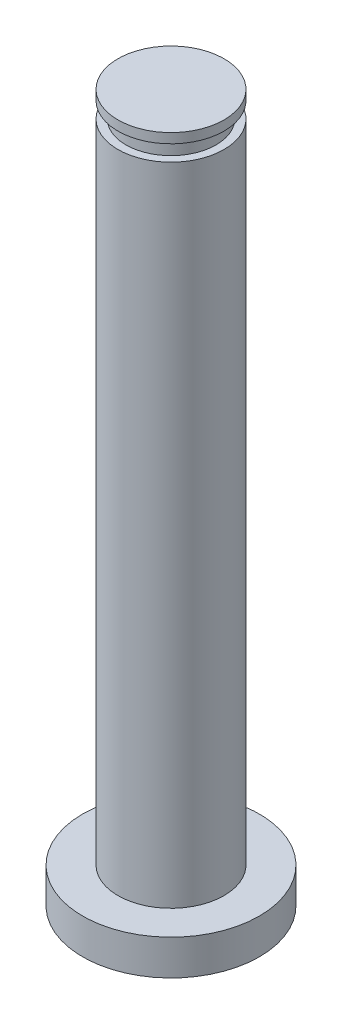
ISO-10303-21;
HEADER;
FILE_DESCRIPTION(('STEP AP214'),'2;1');
FILE_NAME('part.step','',(''),(''),'','','');
FILE_SCHEMA(('AUTOMOTIVE_DESIGN { 1 0 10303 214 1 1 1 1 }'));
ENDSEC;
DATA;
#1=APPLICATION_CONTEXT('core data for automotive mechanical design processes');
#2=APPLICATION_PROTOCOL_DEFINITION('international standard','automotive_design',2000,#1);
#3=PRODUCT_CONTEXT('',#1,'mechanical');
#4=PRODUCT('Part','Part','',(#3));
#5=PRODUCT_RELATED_PRODUCT_CATEGORY('part','',(#4));
#6=PRODUCT_DEFINITION_FORMATION('','',#4);
#7=PRODUCT_DEFINITION_CONTEXT('part definition',#1,'design');
#8=PRODUCT_DEFINITION('design','',#6,#7);
#9=PRODUCT_DEFINITION_SHAPE('','',#8);
#10=(LENGTH_UNIT() NAMED_UNIT(*) SI_UNIT(.MILLI.,.METRE.));
#11=(NAMED_UNIT(*) PLANE_ANGLE_UNIT() SI_UNIT($,.RADIAN.));
#12=(NAMED_UNIT(*) SI_UNIT($,.STERADIAN.) SOLID_ANGLE_UNIT());
#13=UNCERTAINTY_MEASURE_WITH_UNIT(LENGTH_MEASURE(1.E-05),#10,'distance_accuracy_value','');
#14=(GEOMETRIC_REPRESENTATION_CONTEXT(3) GLOBAL_UNCERTAINTY_ASSIGNED_CONTEXT((#13)) GLOBAL_UNIT_ASSIGNED_CONTEXT((#10,
#11,#12)) REPRESENTATION_CONTEXT('',''));
#15=CARTESIAN_POINT('',(0.,0.,0.));
#16=DIRECTION('',(0.,0.,1.));
#17=DIRECTION('',(1.,0.,0.));
#18=AXIS2_PLACEMENT_3D('',#15,#16,#17);
#19=CARTESIAN_POINT('',(-15.,178.,244.));
#20=DIRECTION('',(0.,-1.,0.));
#21=DIRECTION('',(-1.,0.,0.));
#22=AXIS2_PLACEMENT_3D('',#19,#20,#21);
#23=PLANE('',#22);
#24=CARTESIAN_POINT('',(-15.,178.,244.));
#25=DIRECTION('',(0.,-1.,0.));
#26=DIRECTION('',(1.,0.,0.));
#27=AXIS2_PLACEMENT_3D('',#24,#25,#26);
#28=CIRCLE('',#27,3.);
#29=CARTESIAN_POINT('',(-12.,178.,244.));
#30=VERTEX_POINT('',#29);
#31=EDGE_CURVE('E11',#30,#30,#28,.T.);
#32=ORIENTED_EDGE('',*,*,#31,.F.);
#33=EDGE_LOOP('',(#32));
#34=FACE_BOUND('',#33,.T.);
#35=ADVANCED_FACE('F16',(#34),#23,.F.);
#36=CARTESIAN_POINT('',(-15.,178.,244.));
#37=DIRECTION('',(0.,-1.,0.));
#38=DIRECTION('',(1.,0.,0.));
#39=AXIS2_PLACEMENT_3D('',#36,#37,#38);
#40=CYLINDRICAL_SURFACE('',#39,3.);
#41=CARTESIAN_POINT('',(-15.,177.45,244.));
#42=DIRECTION('',(0.,-1.,0.));
#43=DIRECTION('',(1.,0.,0.));
#44=AXIS2_PLACEMENT_3D('',#41,#42,#43);
#45=CIRCLE('',#44,3.);
#46=CARTESIAN_POINT('',(-12.,177.45,244.));
#47=VERTEX_POINT('',#46);
#48=EDGE_CURVE('E90',#47,#47,#45,.T.);
#49=ORIENTED_EDGE('',*,*,#48,.F.);
#50=DIRECTION('',(0.,-1.,0.));
#51=VECTOR('',#50,1.);
#52=CARTESIAN_POINT('',(-12.,178.,244.));
#53=LINE('',#52,#51);
#54=EDGE_CURVE('E25',#30,#47,#53,.T.);
#55=ORIENTED_EDGE('',*,*,#54,.F.);
#56=ORIENTED_EDGE('',*,*,#31,.T.);
#57=ORIENTED_EDGE('',*,*,#54,.T.);
#58=EDGE_LOOP('',(#49,#55,#56,#57));
#59=FACE_BOUND('',#58,.T.);
#60=ADVANCED_FACE('F18',(#59),#40,.T.);
#61=CARTESIAN_POINT('',(-15.,177.45,244.));
#62=DIRECTION('',(0.,-1.,0.));
#63=DIRECTION('',(-1.,0.,0.));
#64=AXIS2_PLACEMENT_3D('',#61,#62,#63);
#65=PLANE('',#64);
#66=CARTESIAN_POINT('',(-15.,177.45,244.));
#67=DIRECTION('',(0.,-1.,0.));
#68=DIRECTION('',(1.,0.,0.));
#69=AXIS2_PLACEMENT_3D('',#66,#67,#68);
#70=CIRCLE('',#69,2.55);
#71=CARTESIAN_POINT('',(-12.45,177.45,244.));
#72=VERTEX_POINT('',#71);
#73=EDGE_CURVE('E96',#72,#72,#70,.T.);
#74=ORIENTED_EDGE('',*,*,#73,.F.);
#75=EDGE_LOOP('',(#74));
#76=FACE_BOUND('',#75,.T.);
#77=ORIENTED_EDGE('',*,*,#48,.T.);
#78=EDGE_LOOP('',(#77));
#79=FACE_BOUND('',#78,.T.);
#80=ADVANCED_FACE('F103',(#76,#79),#65,.T.);
#81=CARTESIAN_POINT('',(-15.,177.55,244.));
#82=DIRECTION('',(0.,-1.,0.));
#83=DIRECTION('',(1.,0.,0.));
#84=AXIS2_PLACEMENT_3D('',#81,#82,#83);
#85=CYLINDRICAL_SURFACE('',#84,2.55);
#86=CARTESIAN_POINT('',(-15.,176.55,244.));
#87=DIRECTION('',(0.,-1.,0.));
#88=DIRECTION('',(1.,0.,0.));
#89=AXIS2_PLACEMENT_3D('',#86,#87,#88);
#90=CIRCLE('',#89,2.55);
#91=CARTESIAN_POINT('',(-12.45,176.55,244.));
#92=VERTEX_POINT('',#91);
#93=EDGE_CURVE('E91',#92,#92,#90,.T.);
#94=ORIENTED_EDGE('',*,*,#93,.F.);
#95=DIRECTION('',(0.,-1.,0.));
#96=VECTOR('',#95,1.);
#97=CARTESIAN_POINT('',(-12.45,177.55,244.));
#98=LINE('',#97,#96);
#99=EDGE_CURVE('E95',#72,#92,#98,.T.);
#100=ORIENTED_EDGE('',*,*,#99,.F.);
#101=ORIENTED_EDGE('',*,*,#73,.T.);
#102=ORIENTED_EDGE('',*,*,#99,.T.);
#103=EDGE_LOOP('',(#94,#100,#101,#102));
#104=FACE_BOUND('',#103,.T.);
#105=ADVANCED_FACE('F110',(#104),#85,.T.);
#106=CARTESIAN_POINT('',(-15.,176.55,244.));
#107=DIRECTION('',(0.,-1.,0.));
#108=DIRECTION('',(-1.,0.,0.));
#109=AXIS2_PLACEMENT_3D('',#106,#107,#108);
#110=PLANE('',#109);
#111=ORIENTED_EDGE('',*,*,#93,.T.);
#112=EDGE_LOOP('',(#111));
#113=FACE_BOUND('',#112,.T.);
#114=CARTESIAN_POINT('',(-15.,176.55,244.));
#115=DIRECTION('',(0.,-1.,0.));
#116=DIRECTION('',(1.,0.,0.));
#117=AXIS2_PLACEMENT_3D('',#114,#115,#116);
#118=CIRCLE('',#117,3.);
#119=CARTESIAN_POINT('',(-12.,176.55,244.));
#120=VERTEX_POINT('',#119);
#121=EDGE_CURVE('E73',#120,#120,#118,.T.);
#122=ORIENTED_EDGE('',*,*,#121,.F.);
#123=EDGE_LOOP('',(#122));
#124=FACE_BOUND('',#123,.T.);
#125=ADVANCED_FACE('F125',(#113,#124),#110,.F.);
#126=CARTESIAN_POINT('',(-15.,178.,244.));
#127=DIRECTION('',(0.,-1.,0.));
#128=DIRECTION('',(1.,0.,0.));
#129=AXIS2_PLACEMENT_3D('',#126,#127,#128);
#130=CYLINDRICAL_SURFACE('',#129,3.);
#131=DIRECTION('',(0.,-1.,0.));
#132=VECTOR('',#131,1.);
#133=CARTESIAN_POINT('',(-12.,178.,244.));
#134=LINE('',#133,#132);
#135=CARTESIAN_POINT('',(-12.,140.,244.));
#136=VERTEX_POINT('',#135);
#137=EDGE_CURVE('E68',#120,#136,#134,.T.);
#138=ORIENTED_EDGE('',*,*,#137,.T.);
#139=CARTESIAN_POINT('',(-15.,140.,244.));
#140=DIRECTION('',(0.,-1.,0.));
#141=DIRECTION('',(1.,0.,0.));
#142=AXIS2_PLACEMENT_3D('',#139,#140,#141);
#143=CIRCLE('',#142,3.);
#144=EDGE_CURVE('E71',#136,#136,#143,.T.);
#145=ORIENTED_EDGE('',*,*,#144,.F.);
#146=ORIENTED_EDGE('',*,*,#137,.F.);
#147=ORIENTED_EDGE('',*,*,#121,.T.);
#148=EDGE_LOOP('',(#138,#145,#146,#147));
#149=FACE_BOUND('',#148,.T.);
#150=ADVANCED_FACE('F70',(#149),#130,.T.);
#151=CARTESIAN_POINT('',(-15.,140.,244.));
#152=DIRECTION('',(0.,-1.,0.));
#153=DIRECTION('',(-1.,0.,0.));
#154=AXIS2_PLACEMENT_3D('',#151,#152,#153);
#155=PLANE('',#154);
#156=ORIENTED_EDGE('',*,*,#144,.T.);
#157=EDGE_LOOP('',(#156));
#158=FACE_BOUND('',#157,.T.);
#159=CARTESIAN_POINT('',(-15.,140.,244.));
#160=DIRECTION('',(0.,-1.,0.));
#161=DIRECTION('',(1.,0.,0.));
#162=AXIS2_PLACEMENT_3D('',#159,#160,#161);
#163=CIRCLE('',#162,5.);
#164=CARTESIAN_POINT('',(-10.,140.,244.));
#165=VERTEX_POINT('',#164);
#166=EDGE_CURVE('E80',#165,#165,#163,.T.);
#167=ORIENTED_EDGE('',*,*,#166,.F.);
#168=EDGE_LOOP('',(#167));
#169=FACE_BOUND('',#168,.T.);
#170=ADVANCED_FACE('F77',(#158,#169),#155,.F.);
#171=CARTESIAN_POINT('',(-15.,138.,244.));
#172=DIRECTION('',(0.,-1.,0.));
#173=DIRECTION('',(-1.,0.,0.));
#174=AXIS2_PLACEMENT_3D('',#171,#172,#173);
#175=PLANE('',#174);
#176=CARTESIAN_POINT('',(-15.,138.,244.));
#177=DIRECTION('',(0.,-1.,0.));
#178=DIRECTION('',(1.,0.,0.));
#179=AXIS2_PLACEMENT_3D('',#176,#177,#178);
#180=CIRCLE('',#179,5.);
#181=CARTESIAN_POINT('',(-10.,138.,244.));
#182=VERTEX_POINT('',#181);
#183=EDGE_CURVE('E144',#182,#182,#180,.T.);
#184=ORIENTED_EDGE('',*,*,#183,.T.);
#185=EDGE_LOOP('',(#184));
#186=FACE_BOUND('',#185,.T.);
#187=ADVANCED_FACE('F119',(#186),#175,.T.);
#188=CARTESIAN_POINT('',(-15.,140.,244.));
#189=DIRECTION('',(0.,-1.,0.));
#190=DIRECTION('',(1.,0.,0.));
#191=AXIS2_PLACEMENT_3D('',#188,#189,#190);
#192=CYLINDRICAL_SURFACE('',#191,5.);
#193=ORIENTED_EDGE('',*,*,#183,.F.);
#194=DIRECTION('',(0.,-1.,0.));
#195=VECTOR('',#194,1.);
#196=CARTESIAN_POINT('',(-10.,140.,244.));
#197=LINE('',#196,#195);
#198=EDGE_CURVE('E84',#165,#182,#197,.T.);
#199=ORIENTED_EDGE('',*,*,#198,.F.);
#200=ORIENTED_EDGE('',*,*,#166,.T.);
#201=ORIENTED_EDGE('',*,*,#198,.T.);
#202=EDGE_LOOP('',(#193,#199,#200,#201));
#203=FACE_BOUND('',#202,.T.);
#204=ADVANCED_FACE('F118',(#203),#192,.T.);
#205=CLOSED_SHELL('',(#35,#60,#80,#105,#125,#150,#170,#187,#204));
#206=MANIFOLD_SOLID_BREP('B1',#205);
#207=ADVANCED_BREP_SHAPE_REPRESENTATION('',(#18,#206),#14);
#208=SHAPE_DEFINITION_REPRESENTATION(#9,#207);
ENDSEC;
END-ISO-10303-21;
